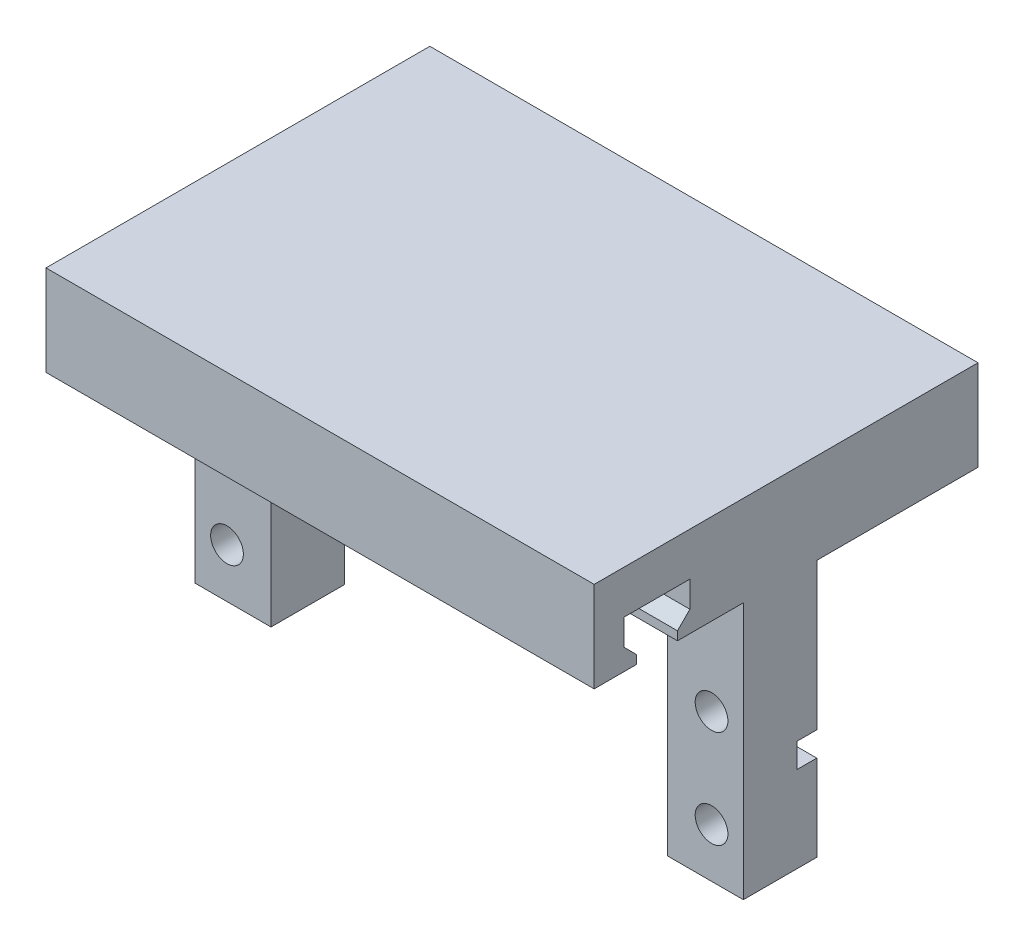
ISO-10303-21;
HEADER;
FILE_DESCRIPTION(('STEP AP214'),'2;1');
FILE_NAME('part.step','',(''),(''),'','','');
FILE_SCHEMA(('AUTOMOTIVE_DESIGN { 1 0 10303 214 1 1 1 1 }'));
ENDSEC;
DATA;
#1=APPLICATION_CONTEXT('core data for automotive mechanical design processes');
#2=APPLICATION_PROTOCOL_DEFINITION('international standard','automotive_design',2000,#1);
#3=PRODUCT_CONTEXT('',#1,'mechanical');
#4=PRODUCT('Part','Part','',(#3));
#5=PRODUCT_RELATED_PRODUCT_CATEGORY('part','',(#4));
#6=PRODUCT_DEFINITION_FORMATION('','',#4);
#7=PRODUCT_DEFINITION_CONTEXT('part definition',#1,'design');
#8=PRODUCT_DEFINITION('design','',#6,#7);
#9=PRODUCT_DEFINITION_SHAPE('','',#8);
#10=(LENGTH_UNIT() NAMED_UNIT(*) SI_UNIT(.MILLI.,.METRE.));
#11=(NAMED_UNIT(*) PLANE_ANGLE_UNIT() SI_UNIT($,.RADIAN.));
#12=(NAMED_UNIT(*) SI_UNIT($,.STERADIAN.) SOLID_ANGLE_UNIT());
#13=UNCERTAINTY_MEASURE_WITH_UNIT(LENGTH_MEASURE(1.E-05),#10,'distance_accuracy_value','');
#14=(GEOMETRIC_REPRESENTATION_CONTEXT(3) GLOBAL_UNCERTAINTY_ASSIGNED_CONTEXT((#13)) GLOBAL_UNIT_ASSIGNED_CONTEXT((#10,
#11,#12)) REPRESENTATION_CONTEXT('',''));
#15=CARTESIAN_POINT('',(0.,0.,0.));
#16=DIRECTION('',(0.,0.,1.));
#17=DIRECTION('',(1.,0.,0.));
#18=AXIS2_PLACEMENT_3D('',#15,#16,#17);
#19=CARTESIAN_POINT('',(-27.3203258381759,0.,24.0100013113022));
#20=DIRECTION('',(0.,0.,1.));
#21=DIRECTION('',(0.,-1.,0.));
#22=AXIS2_PLACEMENT_3D('',#19,#20,#21);
#23=PLANE('',#22);
#24=CARTESIAN_POINT('',(52.75,18.0000009930134,24.0100013113022));
#25=DIRECTION('',(0.,0.,1.));
#26=DIRECTION('',(1.,0.,0.));
#27=AXIS2_PLACEMENT_3D('',#24,#25,#26);
#28=CIRCLE('',#27,1.672);
#29=CARTESIAN_POINT('',(54.422,18.0000009930134,24.0100013113022));
#30=VERTEX_POINT('',#29);
#31=EDGE_CURVE('E501',#30,#30,#28,.F.);
#32=ORIENTED_EDGE('',*,*,#31,.T.);
#33=EDGE_LOOP('',(#32));
#34=FACE_BOUND('',#33,.T.);
#35=CARTESIAN_POINT('',(52.75,8.00000099301338,24.0100013113022));
#36=DIRECTION('',(0.,0.,1.));
#37=DIRECTION('',(1.,0.,0.));
#38=AXIS2_PLACEMENT_3D('',#35,#36,#37);
#39=CIRCLE('',#38,1.672);
#40=CARTESIAN_POINT('',(54.422,8.00000099301338,24.0100013113022));
#41=VERTEX_POINT('',#40);
#42=EDGE_CURVE('E502',#41,#41,#39,.F.);
#43=ORIENTED_EDGE('',*,*,#42,.T.);
#44=EDGE_LOOP('',(#43));
#45=FACE_BOUND('',#44,.T.);
#46=CARTESIAN_POINT('',(3.25,18.0000009930134,24.0100013113022));
#47=DIRECTION('',(0.,0.,1.));
#48=DIRECTION('',(1.,0.,0.));
#49=AXIS2_PLACEMENT_3D('',#46,#47,#48);
#50=CIRCLE('',#49,1.672);
#51=CARTESIAN_POINT('',(4.922,18.0000009930134,24.0100013113022));
#52=VERTEX_POINT('',#51);
#53=EDGE_CURVE('E494',#52,#52,#50,.T.);
#54=ORIENTED_EDGE('',*,*,#53,.F.);
#55=EDGE_LOOP('',(#54));
#56=FACE_BOUND('',#55,.T.);
#57=DIRECTION('',(1.,0.,0.));
#58=VECTOR('',#57,1.);
#59=CARTESIAN_POINT('',(-27.3203258381759,2.96929099301338,24.0100013113022));
#60=LINE('',#59,#58);
#61=CARTESIAN_POINT('',(0.,2.96929099301338,24.0100013113022));
#62=VERTEX_POINT('',#61);
#63=CARTESIAN_POINT('',(7.746,2.96929099301338,24.0100013113022));
#64=VERTEX_POINT('',#63);
#65=EDGE_CURVE('E238',#62,#64,#60,.T.);
#66=ORIENTED_EDGE('',*,*,#65,.T.);
#67=DIRECTION('',(0.,1.,0.));
#68=VECTOR('',#67,1.);
#69=CARTESIAN_POINT('',(7.746,0.,24.0100013113022));
#70=LINE('',#69,#68);
#71=CARTESIAN_POINT('',(7.746,23.6310009930134,24.0100013113022));
#72=VERTEX_POINT('',#71);
#73=EDGE_CURVE('E219',#64,#72,#70,.T.);
#74=ORIENTED_EDGE('',*,*,#73,.T.);
#75=DIRECTION('',(1.,0.,0.));
#76=VECTOR('',#75,1.);
#77=CARTESIAN_POINT('',(0.,23.6310009930134,24.0100013113022));
#78=LINE('',#77,#76);
#79=CARTESIAN_POINT('',(48.254,23.6310009930134,24.0100013113022));
#80=VERTEX_POINT('',#79);
#81=EDGE_CURVE('E243',#72,#80,#78,.T.);
#82=ORIENTED_EDGE('',*,*,#81,.T.);
#83=DIRECTION('',(0.,-1.,0.));
#84=VECTOR('',#83,1.);
#85=CARTESIAN_POINT('',(48.254,0.,24.0100013113022));
#86=LINE('',#85,#84);
#87=CARTESIAN_POINT('',(48.254,2.96929099301338,24.0100013113022));
#88=VERTEX_POINT('',#87);
#89=EDGE_CURVE('E230',#80,#88,#86,.T.);
#90=ORIENTED_EDGE('',*,*,#89,.T.);
#91=CARTESIAN_POINT('',(56.,2.96929099301338,24.0100013113022));
#92=VERTEX_POINT('',#91);
#93=EDGE_CURVE('E250',#88,#92,#60,.T.);
#94=ORIENTED_EDGE('',*,*,#93,.T.);
#95=DIRECTION('',(0.,-1.,0.));
#96=VECTOR('',#95,1.);
#97=CARTESIAN_POINT('',(56.,0.,24.0100013113022));
#98=LINE('',#97,#96);
#99=CARTESIAN_POINT('',(56.,29.2400009930134,24.0100013113022));
#100=VERTEX_POINT('',#99);
#101=EDGE_CURVE('E407',#100,#92,#98,.T.);
#102=ORIENTED_EDGE('',*,*,#101,.F.);
#103=DIRECTION('',(1.,0.,0.));
#104=VECTOR('',#103,1.);
#105=CARTESIAN_POINT('',(-27.3203258381759,29.2400009930134,24.0100013113022));
#106=LINE('',#105,#104);
#107=CARTESIAN_POINT('',(0.,29.2400009930134,24.0100013113022));
#108=VERTEX_POINT('',#107);
#109=EDGE_CURVE('E253',#108,#100,#106,.T.);
#110=ORIENTED_EDGE('',*,*,#109,.F.);
#111=DIRECTION('',(0.,1.,0.));
#112=VECTOR('',#111,1.);
#113=CARTESIAN_POINT('',(0.,0.,24.0100013113022));
#114=LINE('',#113,#112);
#115=EDGE_CURVE('E248',#62,#108,#114,.T.);
#116=ORIENTED_EDGE('',*,*,#115,.F.);
#117=EDGE_LOOP('',(#66,#74,#82,#90,#94,#102,#110,#116));
#118=FACE_BOUND('',#117,.T.);
#119=CARTESIAN_POINT('',(3.25,8.00000099301338,24.0100013113022));
#120=DIRECTION('',(0.,0.,1.));
#121=DIRECTION('',(1.,0.,0.));
#122=AXIS2_PLACEMENT_3D('',#119,#120,#121);
#123=CIRCLE('',#122,1.672);
#124=CARTESIAN_POINT('',(4.922,8.00000099301338,24.0100013113022));
#125=VERTEX_POINT('',#124);
#126=EDGE_CURVE('E508',#125,#125,#123,.T.);
#127=ORIENTED_EDGE('',*,*,#126,.F.);
#128=EDGE_LOOP('',(#127));
#129=FACE_BOUND('',#128,.T.);
#130=ADVANCED_FACE('F35',(#34,#45,#56,#118,#129),#23,.T.);
#131=CARTESIAN_POINT('',(-27.3203258381759,2.96929099301338,0.));
#132=DIRECTION('',(0.,-1.,0.));
#133=DIRECTION('',(0.,0.,-1.));
#134=AXIS2_PLACEMENT_3D('',#131,#132,#133);
#135=PLANE('',#134);
#136=DIRECTION('',(1.,0.,0.));
#137=VECTOR('',#136,1.);
#138=CARTESIAN_POINT('',(-27.3203258381759,2.96929099301338,16.5100013113022));
#139=LINE('',#138,#137);
#140=CARTESIAN_POINT('',(0.,2.96929099301338,16.5100013113022));
#141=VERTEX_POINT('',#140);
#142=CARTESIAN_POINT('',(7.746,2.96929099301338,16.5100013113022));
#143=VERTEX_POINT('',#142);
#144=EDGE_CURVE('E241',#141,#143,#139,.T.);
#145=ORIENTED_EDGE('',*,*,#144,.T.);
#146=DIRECTION('',(0.,0.,1.));
#147=VECTOR('',#146,1.);
#148=CARTESIAN_POINT('',(7.746,2.96929099301338,-28.9631151876151));
#149=LINE('',#148,#147);
#150=EDGE_CURVE('E222',#143,#64,#149,.T.);
#151=ORIENTED_EDGE('',*,*,#150,.T.);
#152=ORIENTED_EDGE('',*,*,#65,.F.);
#153=DIRECTION('',(0.,0.,1.));
#154=VECTOR('',#153,1.);
#155=CARTESIAN_POINT('',(0.,2.96929099301338,0.));
#156=LINE('',#155,#154);
#157=EDGE_CURVE('E473',#141,#62,#156,.T.);
#158=ORIENTED_EDGE('',*,*,#157,.F.);
#159=EDGE_LOOP('',(#145,#151,#152,#158));
#160=FACE_BOUND('',#159,.T.);
#161=ADVANCED_FACE('F236',(#160),#135,.T.);
#162=ORIENTED_EDGE('',*,*,#93,.F.);
#163=DIRECTION('',(0.,0.,1.));
#164=VECTOR('',#163,1.);
#165=CARTESIAN_POINT('',(48.254,2.96929099301338,-28.9631151876151));
#166=LINE('',#165,#164);
#167=CARTESIAN_POINT('',(48.254,2.96929099301338,16.5100013113022));
#168=VERTEX_POINT('',#167);
#169=EDGE_CURVE('E242',#168,#88,#166,.T.);
#170=ORIENTED_EDGE('',*,*,#169,.F.);
#171=CARTESIAN_POINT('',(56.,2.96929099301338,16.5100013113022));
#172=VERTEX_POINT('',#171);
#173=EDGE_CURVE('E249',#168,#172,#139,.T.);
#174=ORIENTED_EDGE('',*,*,#173,.T.);
#175=DIRECTION('',(0.,0.,-1.));
#176=VECTOR('',#175,1.);
#177=CARTESIAN_POINT('',(56.,2.96929099301338,0.));
#178=LINE('',#177,#176);
#179=EDGE_CURVE('E411',#92,#172,#178,.T.);
#180=ORIENTED_EDGE('',*,*,#179,.F.);
#181=EDGE_LOOP('',(#162,#170,#174,#180));
#182=FACE_BOUND('',#181,.T.);
#183=ADVANCED_FACE('F453',(#182),#135,.T.);
#184=CARTESIAN_POINT('',(-27.3203258381759,0.,16.5100013113022));
#185=DIRECTION('',(0.,0.,1.));
#186=DIRECTION('',(1.,0.,0.));
#187=AXIS2_PLACEMENT_3D('',#184,#185,#186);
#188=PLANE('',#187);
#189=CARTESIAN_POINT('',(3.25,8.00000099301338,16.5100013113022));
#190=DIRECTION('',(0.,0.,1.));
#191=DIRECTION('',(1.,0.,0.));
#192=AXIS2_PLACEMENT_3D('',#189,#190,#191);
#193=CIRCLE('',#192,1.672);
#194=CARTESIAN_POINT('',(4.922,8.00000099301338,16.5100013113022));
#195=VERTEX_POINT('',#194);
#196=EDGE_CURVE('E497',#195,#195,#193,.F.);
#197=ORIENTED_EDGE('',*,*,#196,.F.);
#198=EDGE_LOOP('',(#197));
#199=FACE_BOUND('',#198,.T.);
#200=DIRECTION('',(0.,-1.,0.));
#201=VECTOR('',#200,1.);
#202=CARTESIAN_POINT('',(7.746,0.,16.5100013113022));
#203=LINE('',#202,#201);
#204=CARTESIAN_POINT('',(7.746,11.7500009930134,16.5100013113022));
#205=VERTEX_POINT('',#204);
#206=EDGE_CURVE('E484',#205,#143,#203,.T.);
#207=ORIENTED_EDGE('',*,*,#206,.T.);
#208=ORIENTED_EDGE('',*,*,#144,.F.);
#209=DIRECTION('',(0.,1.,0.));
#210=VECTOR('',#209,1.);
#211=CARTESIAN_POINT('',(0.,0.,16.5100013113022));
#212=LINE('',#211,#210);
#213=CARTESIAN_POINT('',(0.,11.7500009930134,16.5100013113022));
#214=VERTEX_POINT('',#213);
#215=EDGE_CURVE('E475',#141,#214,#212,.T.);
#216=ORIENTED_EDGE('',*,*,#215,.T.);
#217=DIRECTION('',(1.,0.,0.));
#218=VECTOR('',#217,1.);
#219=CARTESIAN_POINT('',(-27.3203258381759,11.7500009930134,16.5100013113022));
#220=LINE('',#219,#218);
#221=EDGE_CURVE('E430',#214,#205,#220,.T.);
#222=ORIENTED_EDGE('',*,*,#221,.T.);
#223=EDGE_LOOP('',(#207,#208,#216,#222));
#224=FACE_BOUND('',#223,.T.);
#225=ADVANCED_FACE('F628',(#199,#224),#188,.F.);
#226=CARTESIAN_POINT('',(52.75,8.00000099301338,16.5100013113022));
#227=DIRECTION('',(0.,0.,1.));
#228=DIRECTION('',(1.,0.,0.));
#229=AXIS2_PLACEMENT_3D('',#226,#227,#228);
#230=CIRCLE('',#229,1.672);
#231=CARTESIAN_POINT('',(54.422,8.00000099301338,16.5100013113022));
#232=VERTEX_POINT('',#231);
#233=EDGE_CURVE('E498',#232,#232,#230,.T.);
#234=ORIENTED_EDGE('',*,*,#233,.T.);
#235=EDGE_LOOP('',(#234));
#236=FACE_BOUND('',#235,.T.);
#237=DIRECTION('',(0.,1.,0.));
#238=VECTOR('',#237,1.);
#239=CARTESIAN_POINT('',(48.254,0.,16.5100013113022));
#240=LINE('',#239,#238);
#241=CARTESIAN_POINT('',(48.254,11.7500009930134,16.5100013113022));
#242=VERTEX_POINT('',#241);
#243=EDGE_CURVE('E442',#168,#242,#240,.T.);
#244=ORIENTED_EDGE('',*,*,#243,.T.);
#245=CARTESIAN_POINT('',(56.,11.7500009930134,16.5100013113022));
#246=VERTEX_POINT('',#245);
#247=EDGE_CURVE('E432',#242,#246,#220,.T.);
#248=ORIENTED_EDGE('',*,*,#247,.T.);
#249=DIRECTION('',(0.,-1.,0.));
#250=VECTOR('',#249,1.);
#251=CARTESIAN_POINT('',(56.,0.,16.5100013113022));
#252=LINE('',#251,#250);
#253=EDGE_CURVE('E414',#246,#172,#252,.T.);
#254=ORIENTED_EDGE('',*,*,#253,.T.);
#255=ORIENTED_EDGE('',*,*,#173,.F.);
#256=EDGE_LOOP('',(#244,#248,#254,#255));
#257=FACE_BOUND('',#256,.T.);
#258=ADVANCED_FACE('F439',(#236,#257),#188,.F.);
#259=CARTESIAN_POINT('',(-27.3203258381759,11.7500009930134,0.));
#260=DIRECTION('',(0.,-1.,0.));
#261=DIRECTION('',(0.,0.,-1.));
#262=AXIS2_PLACEMENT_3D('',#259,#260,#261);
#263=PLANE('',#262);
#264=DIRECTION('',(0.,0.,1.));
#265=VECTOR('',#264,1.);
#266=CARTESIAN_POINT('',(7.746,11.7500009930134,0.));
#267=LINE('',#266,#265);
#268=CARTESIAN_POINT('',(7.746,11.7500009930134,18.5100013113022));
#269=VERTEX_POINT('',#268);
#270=EDGE_CURVE('E408',#205,#269,#267,.T.);
#271=ORIENTED_EDGE('',*,*,#270,.F.);
#272=ORIENTED_EDGE('',*,*,#221,.F.);
#273=DIRECTION('',(0.,0.,1.));
#274=VECTOR('',#273,1.);
#275=CARTESIAN_POINT('',(0.,11.7500009930134,0.));
#276=LINE('',#275,#274);
#277=CARTESIAN_POINT('',(0.,11.7500009930134,18.5100013113022));
#278=VERTEX_POINT('',#277);
#279=EDGE_CURVE('E400',#214,#278,#276,.T.);
#280=ORIENTED_EDGE('',*,*,#279,.T.);
#281=DIRECTION('',(1.,0.,0.));
#282=VECTOR('',#281,1.);
#283=CARTESIAN_POINT('',(-27.3203258381759,11.7500009930134,18.5100013113022));
#284=LINE('',#283,#282);
#285=EDGE_CURVE('E427',#278,#269,#284,.T.);
#286=ORIENTED_EDGE('',*,*,#285,.T.);
#287=EDGE_LOOP('',(#271,#272,#280,#286));
#288=FACE_BOUND('',#287,.T.);
#289=ADVANCED_FACE('F479',(#288),#263,.F.);
#290=DIRECTION('',(0.,0.,-1.));
#291=VECTOR('',#290,1.);
#292=CARTESIAN_POINT('',(48.254,11.7500009930134,0.));
#293=LINE('',#292,#291);
#294=CARTESIAN_POINT('',(48.254,11.7500009930134,18.5100013113022));
#295=VERTEX_POINT('',#294);
#296=EDGE_CURVE('E465',#295,#242,#293,.T.);
#297=ORIENTED_EDGE('',*,*,#296,.F.);
#298=CARTESIAN_POINT('',(56.,11.7500009930134,18.5100013113022));
#299=VERTEX_POINT('',#298);
#300=EDGE_CURVE('E429',#295,#299,#284,.T.);
#301=ORIENTED_EDGE('',*,*,#300,.T.);
#302=DIRECTION('',(0.,0.,-1.));
#303=VECTOR('',#302,1.);
#304=CARTESIAN_POINT('',(56.,11.7500009930134,0.));
#305=LINE('',#304,#303);
#306=EDGE_CURVE('E417',#299,#246,#305,.T.);
#307=ORIENTED_EDGE('',*,*,#306,.T.);
#308=ORIENTED_EDGE('',*,*,#247,.F.);
#309=EDGE_LOOP('',(#297,#301,#307,#308));
#310=FACE_BOUND('',#309,.T.);
#311=ADVANCED_FACE('F446',(#310),#263,.F.);
#312=CARTESIAN_POINT('',(-27.3203258381759,0.,18.5100013113022));
#313=DIRECTION('',(0.,0.,1.));
#314=DIRECTION('',(0.,-1.,0.));
#315=AXIS2_PLACEMENT_3D('',#312,#313,#314);
#316=PLANE('',#315);
#317=DIRECTION('',(0.,1.,0.));
#318=VECTOR('',#317,1.);
#319=CARTESIAN_POINT('',(7.746,0.,18.5100013113022));
#320=LINE('',#319,#318);
#321=CARTESIAN_POINT('',(7.746,14.2500009930134,18.5100013113022));
#322=VERTEX_POINT('',#321);
#323=EDGE_CURVE('E469',#269,#322,#320,.T.);
#324=ORIENTED_EDGE('',*,*,#323,.F.);
#325=ORIENTED_EDGE('',*,*,#285,.F.);
#326=DIRECTION('',(0.,1.,0.));
#327=VECTOR('',#326,1.);
#328=CARTESIAN_POINT('',(0.,0.,18.5100013113022));
#329=LINE('',#328,#327);
#330=CARTESIAN_POINT('',(0.,14.2500009930134,18.5100013113022));
#331=VERTEX_POINT('',#330);
#332=EDGE_CURVE('E398',#278,#331,#329,.T.);
#333=ORIENTED_EDGE('',*,*,#332,.T.);
#334=DIRECTION('',(1.,0.,0.));
#335=VECTOR('',#334,1.);
#336=CARTESIAN_POINT('',(-27.3203258381759,14.2500009930134,18.5100013113022));
#337=LINE('',#336,#335);
#338=EDGE_CURVE('E396',#331,#322,#337,.T.);
#339=ORIENTED_EDGE('',*,*,#338,.T.);
#340=EDGE_LOOP('',(#324,#325,#333,#339));
#341=FACE_BOUND('',#340,.T.);
#342=ADVANCED_FACE('F483',(#341),#316,.F.);
#343=DIRECTION('',(0.,-1.,0.));
#344=VECTOR('',#343,1.);
#345=CARTESIAN_POINT('',(48.254,0.,18.5100013113022));
#346=LINE('',#345,#344);
#347=CARTESIAN_POINT('',(48.254,14.2500009930134,18.5100013113022));
#348=VERTEX_POINT('',#347);
#349=EDGE_CURVE('E463',#348,#295,#346,.T.);
#350=ORIENTED_EDGE('',*,*,#349,.F.);
#351=CARTESIAN_POINT('',(56.,14.2500009930134,18.5100013113022));
#352=VERTEX_POINT('',#351);
#353=EDGE_CURVE('E426',#348,#352,#337,.T.);
#354=ORIENTED_EDGE('',*,*,#353,.T.);
#355=DIRECTION('',(0.,-1.,0.));
#356=VECTOR('',#355,1.);
#357=CARTESIAN_POINT('',(56.,0.,18.5100013113022));
#358=LINE('',#357,#356);
#359=EDGE_CURVE('E420',#352,#299,#358,.T.);
#360=ORIENTED_EDGE('',*,*,#359,.T.);
#361=ORIENTED_EDGE('',*,*,#300,.F.);
#362=EDGE_LOOP('',(#350,#354,#360,#361));
#363=FACE_BOUND('',#362,.T.);
#364=ADVANCED_FACE('F599',(#363),#316,.F.);
#365=CARTESIAN_POINT('',(-27.3203258381759,14.2500009930134,0.));
#366=DIRECTION('',(0.,-1.,0.));
#367=DIRECTION('',(0.,0.,-1.));
#368=AXIS2_PLACEMENT_3D('',#365,#366,#367);
#369=PLANE('',#368);
#370=DIRECTION('',(1.,0.,0.));
#371=VECTOR('',#370,1.);
#372=CARTESIAN_POINT('',(-27.3203258381759,14.2500009930134,16.5100013113022));
#373=LINE('',#372,#371);
#374=CARTESIAN_POINT('',(0.,14.2500009930134,16.5100013113022));
#375=VERTEX_POINT('',#374);
#376=CARTESIAN_POINT('',(7.746,14.2500009930134,16.5100013113022));
#377=VERTEX_POINT('',#376);
#378=EDGE_CURVE('E386',#375,#377,#373,.T.);
#379=ORIENTED_EDGE('',*,*,#378,.T.);
#380=DIRECTION('',(0.,0.,1.));
#381=VECTOR('',#380,1.);
#382=CARTESIAN_POINT('',(7.746,14.2500009930134,0.));
#383=LINE('',#382,#381);
#384=EDGE_CURVE('E467',#377,#322,#383,.T.);
#385=ORIENTED_EDGE('',*,*,#384,.T.);
#386=ORIENTED_EDGE('',*,*,#338,.F.);
#387=DIRECTION('',(0.,0.,1.));
#388=VECTOR('',#387,1.);
#389=CARTESIAN_POINT('',(0.,14.2500009930134,0.));
#390=LINE('',#389,#388);
#391=EDGE_CURVE('E380',#375,#331,#390,.T.);
#392=ORIENTED_EDGE('',*,*,#391,.F.);
#393=EDGE_LOOP('',(#379,#385,#386,#392));
#394=FACE_BOUND('',#393,.T.);
#395=ADVANCED_FACE('F394',(#394),#369,.T.);
#396=ORIENTED_EDGE('',*,*,#353,.F.);
#397=DIRECTION('',(0.,0.,-1.));
#398=VECTOR('',#397,1.);
#399=CARTESIAN_POINT('',(48.254,14.2500009930134,0.));
#400=LINE('',#399,#398);
#401=CARTESIAN_POINT('',(48.254,14.2500009930134,16.5100013113022));
#402=VERTEX_POINT('',#401);
#403=EDGE_CURVE('E460',#348,#402,#400,.T.);
#404=ORIENTED_EDGE('',*,*,#403,.T.);
#405=CARTESIAN_POINT('',(56.,14.2500009930134,16.5100013113022));
#406=VERTEX_POINT('',#405);
#407=EDGE_CURVE('E392',#402,#406,#373,.T.);
#408=ORIENTED_EDGE('',*,*,#407,.T.);
#409=DIRECTION('',(0.,0.,-1.));
#410=VECTOR('',#409,1.);
#411=CARTESIAN_POINT('',(56.,14.2500009930134,0.));
#412=LINE('',#411,#410);
#413=EDGE_CURVE('E259',#352,#406,#412,.T.);
#414=ORIENTED_EDGE('',*,*,#413,.F.);
#415=EDGE_LOOP('',(#396,#404,#408,#414));
#416=FACE_BOUND('',#415,.T.);
#417=ADVANCED_FACE('F529',(#416),#369,.T.);
#418=CARTESIAN_POINT('',(-27.3203258381759,0.,16.5100013113022));
#419=DIRECTION('',(0.,0.,1.));
#420=DIRECTION('',(1.,0.,0.));
#421=AXIS2_PLACEMENT_3D('',#418,#419,#420);
#422=PLANE('',#421);
#423=CARTESIAN_POINT('',(52.75,18.0000009930134,16.5100013113022));
#424=DIRECTION('',(0.,0.,1.));
#425=DIRECTION('',(1.,0.,0.));
#426=AXIS2_PLACEMENT_3D('',#423,#424,#425);
#427=CIRCLE('',#426,1.672);
#428=CARTESIAN_POINT('',(54.422,18.0000009930134,16.5100013113022));
#429=VERTEX_POINT('',#428);
#430=EDGE_CURVE('E505',#429,#429,#427,.T.);
#431=ORIENTED_EDGE('',*,*,#430,.T.);
#432=EDGE_LOOP('',(#431));
#433=FACE_BOUND('',#432,.T.);
#434=CARTESIAN_POINT('',(3.25,18.0000009930134,16.5100013113022));
#435=DIRECTION('',(0.,0.,1.));
#436=DIRECTION('',(1.,0.,0.));
#437=AXIS2_PLACEMENT_3D('',#434,#435,#436);
#438=CIRCLE('',#437,1.672);
#439=CARTESIAN_POINT('',(4.922,18.0000009930134,16.5100013113022));
#440=VERTEX_POINT('',#439);
#441=EDGE_CURVE('E231',#440,#440,#438,.F.);
#442=ORIENTED_EDGE('',*,*,#441,.F.);
#443=EDGE_LOOP('',(#442));
#444=FACE_BOUND('',#443,.T.);
#445=CARTESIAN_POINT('',(7.746,23.6310009930134,16.5100013113022));
#446=VERTEX_POINT('',#445);
#447=EDGE_CURVE('E389',#446,#377,#203,.T.);
#448=ORIENTED_EDGE('',*,*,#447,.T.);
#449=ORIENTED_EDGE('',*,*,#378,.F.);
#450=DIRECTION('',(0.,1.,0.));
#451=VECTOR('',#450,1.);
#452=CARTESIAN_POINT('',(0.,0.,16.5100013113022));
#453=LINE('',#452,#451);
#454=CARTESIAN_POINT('',(0.,29.2400009930134,16.5100013113022));
#455=VERTEX_POINT('',#454);
#456=EDGE_CURVE('E292',#375,#455,#453,.T.);
#457=ORIENTED_EDGE('',*,*,#456,.T.);
#458=DIRECTION('',(1.,0.,0.));
#459=VECTOR('',#458,1.);
#460=CARTESIAN_POINT('',(-27.3203258381759,29.2400009930134,16.5100013113022));
#461=LINE('',#460,#459);
#462=CARTESIAN_POINT('',(56.,29.2400009930134,16.5100013113022));
#463=VERTEX_POINT('',#462);
#464=EDGE_CURVE('E257',#455,#463,#461,.T.);
#465=ORIENTED_EDGE('',*,*,#464,.T.);
#466=DIRECTION('',(0.,-1.,0.));
#467=VECTOR('',#466,1.);
#468=CARTESIAN_POINT('',(56.,0.,16.5100013113022));
#469=LINE('',#468,#467);
#470=EDGE_CURVE('E404',#463,#406,#469,.T.);
#471=ORIENTED_EDGE('',*,*,#470,.T.);
#472=ORIENTED_EDGE('',*,*,#407,.F.);
#473=DIRECTION('',(0.,-1.,0.));
#474=VECTOR('',#473,1.);
#475=CARTESIAN_POINT('',(48.254,0.,16.5100013113022));
#476=LINE('',#475,#474);
#477=CARTESIAN_POINT('',(48.254,23.6310009930134,16.5100013113022));
#478=VERTEX_POINT('',#477);
#479=EDGE_CURVE('E11',#478,#402,#476,.T.);
#480=ORIENTED_EDGE('',*,*,#479,.F.);
#481=DIRECTION('',(-1.,0.,0.));
#482=VECTOR('',#481,1.);
#483=CARTESIAN_POINT('',(0.,23.6310009930134,16.5100013113022));
#484=LINE('',#483,#482);
#485=EDGE_CURVE('E485',#478,#446,#484,.T.);
#486=ORIENTED_EDGE('',*,*,#485,.T.);
#487=EDGE_LOOP('',(#448,#449,#457,#465,#471,#472,#480,#486));
#488=FACE_BOUND('',#487,.T.);
#489=ADVANCED_FACE('F387',(#433,#444,#488),#422,.F.);
#490=CARTESIAN_POINT('',(56.,29.2400009930134,30.73950111866));
#491=DIRECTION('',(0.,1.,0.));
#492=DIRECTION('',(0.,0.,1.));
#493=AXIS2_PLACEMENT_3D('',#490,#491,#492);
#494=PLANE('',#493);
#495=ORIENTED_EDGE('',*,*,#464,.F.);
#496=DIRECTION('',(0.,0.,-1.));
#497=VECTOR('',#496,1.);
#498=CARTESIAN_POINT('',(0.,29.2400009930134,30.73950111866));
#499=LINE('',#498,#497);
#500=CARTESIAN_POINT('',(0.,29.2400009930134,0.0385884195566177));
#501=VERTEX_POINT('',#500);
#502=EDGE_CURVE('E310',#455,#501,#499,.T.);
#503=ORIENTED_EDGE('',*,*,#502,.T.);
#504=DIRECTION('',(-1.,0.,0.));
#505=VECTOR('',#504,1.);
#506=CARTESIAN_POINT('',(56.,29.2400009930134,0.0385884195566177));
#507=LINE('',#506,#505);
#508=CARTESIAN_POINT('',(56.,29.2400009930134,0.0385884195566177));
#509=VERTEX_POINT('',#508);
#510=EDGE_CURVE('E316',#509,#501,#507,.T.);
#511=ORIENTED_EDGE('',*,*,#510,.F.);
#512=DIRECTION('',(0.,0.,-1.));
#513=VECTOR('',#512,1.);
#514=CARTESIAN_POINT('',(56.,29.2400009930134,30.73950111866));
#515=LINE('',#514,#513);
#516=EDGE_CURVE('E57',#463,#509,#515,.T.);
#517=ORIENTED_EDGE('',*,*,#516,.F.);
#518=EDGE_LOOP('',(#495,#503,#511,#517));
#519=FACE_BOUND('',#518,.T.);
#520=ADVANCED_FACE('F376',(#519),#494,.F.);
#521=CARTESIAN_POINT('',(56.,38.4900011122227,0.0385884195566177));
#522=DIRECTION('',(0.,-1.,0.));
#523=DIRECTION('',(0.,0.,-1.));
#524=AXIS2_PLACEMENT_3D('',#521,#522,#523);
#525=PLANE('',#524);
#526=DIRECTION('',(0.,0.,1.));
#527=VECTOR('',#526,1.);
#528=CARTESIAN_POINT('',(0.,38.4900011122227,0.0385884195566177));
#529=LINE('',#528,#527);
#530=CARTESIAN_POINT('',(0.,38.4900011122227,0.0385884195566177));
#531=VERTEX_POINT('',#530);
#532=CARTESIAN_POINT('',(0.,38.4900011122227,39.2500013113022));
#533=VERTEX_POINT('',#532);
#534=EDGE_CURVE('E288',#531,#533,#529,.T.);
#535=ORIENTED_EDGE('',*,*,#534,.T.);
#536=DIRECTION('',(-1.,0.,0.));
#537=VECTOR('',#536,1.);
#538=CARTESIAN_POINT('',(56.,38.4900011122227,39.2500013113022));
#539=LINE('',#538,#537);
#540=CARTESIAN_POINT('',(56.,38.4900011122227,39.2500013113022));
#541=VERTEX_POINT('',#540);
#542=EDGE_CURVE('E43',#541,#533,#539,.T.);
#543=ORIENTED_EDGE('',*,*,#542,.F.);
#544=DIRECTION('',(0.,0.,1.));
#545=VECTOR('',#544,1.);
#546=CARTESIAN_POINT('',(56.,38.4900011122227,0.0385884195566177));
#547=LINE('',#546,#545);
#548=CARTESIAN_POINT('',(56.,38.4900011122227,0.0385884195566177));
#549=VERTEX_POINT('',#548);
#550=EDGE_CURVE('E260',#549,#541,#547,.T.);
#551=ORIENTED_EDGE('',*,*,#550,.F.);
#552=DIRECTION('',(-1.,0.,0.));
#553=VECTOR('',#552,1.);
#554=CARTESIAN_POINT('',(56.,38.4900011122227,0.0385884195566177));
#555=LINE('',#554,#553);
#556=EDGE_CURVE('E287',#549,#531,#555,.T.);
#557=ORIENTED_EDGE('',*,*,#556,.T.);
#558=EDGE_LOOP('',(#535,#543,#551,#557));
#559=FACE_BOUND('',#558,.T.);
#560=ADVANCED_FACE('F37',(#559),#525,.F.);
#561=CARTESIAN_POINT('',(56.,38.4900011122227,39.2500013113022));
#562=DIRECTION('',(0.,0.,-1.));
#563=DIRECTION('',(-1.,0.,0.));
#564=AXIS2_PLACEMENT_3D('',#561,#562,#563);
#565=PLANE('',#564);
#566=DIRECTION('',(0.,-1.,0.));
#567=VECTOR('',#566,1.);
#568=CARTESIAN_POINT('',(0.,38.4900011122227,39.2500013113022));
#569=LINE('',#568,#567);
#570=CARTESIAN_POINT('',(0.,29.2400009930134,39.2500013113022));
#571=VERTEX_POINT('',#570);
#572=EDGE_CURVE('E291',#533,#571,#569,.T.);
#573=ORIENTED_EDGE('',*,*,#572,.T.);
#574=DIRECTION('',(-1.,0.,0.));
#575=VECTOR('',#574,1.);
#576=CARTESIAN_POINT('',(56.,29.2400009930134,39.2500013113022));
#577=LINE('',#576,#575);
#578=CARTESIAN_POINT('',(56.,29.2400009930134,39.2500013113022));
#579=VERTEX_POINT('',#578);
#580=EDGE_CURVE('E343',#579,#571,#577,.T.);
#581=ORIENTED_EDGE('',*,*,#580,.F.);
#582=DIRECTION('',(0.,-1.,0.));
#583=VECTOR('',#582,1.);
#584=CARTESIAN_POINT('',(56.,38.4900011122227,39.2500013113022));
#585=LINE('',#584,#583);
#586=EDGE_CURVE('E263',#541,#579,#585,.T.);
#587=ORIENTED_EDGE('',*,*,#586,.F.);
#588=ORIENTED_EDGE('',*,*,#542,.T.);
#589=EDGE_LOOP('',(#573,#581,#587,#588));
#590=FACE_BOUND('',#589,.T.);
#591=ADVANCED_FACE('F348',(#590),#565,.F.);
#592=CARTESIAN_POINT('',(56.,29.2400009930134,34.9305011332035));
#593=DIRECTION('',(0.,1.,0.));
#594=DIRECTION('',(0.,0.,1.));
#595=AXIS2_PLACEMENT_3D('',#592,#593,#594);
#596=PLANE('',#595);
#597=DIRECTION('',(0.,0.,-1.));
#598=VECTOR('',#597,1.);
#599=CARTESIAN_POINT('',(0.,29.2400009930134,34.9305011332035));
#600=LINE('',#599,#598);
#601=CARTESIAN_POINT('',(0.,29.2400009930134,34.9305011332035));
#602=VERTEX_POINT('',#601);
#603=EDGE_CURVE('E294',#571,#602,#600,.T.);
#604=ORIENTED_EDGE('',*,*,#603,.T.);
#605=DIRECTION('',(-1.,0.,0.));
#606=VECTOR('',#605,1.);
#607=CARTESIAN_POINT('',(56.,29.2400009930134,34.9305011332035));
#608=LINE('',#607,#606);
#609=CARTESIAN_POINT('',(56.,29.2400009930134,34.9305011332035));
#610=VERTEX_POINT('',#609);
#611=EDGE_CURVE('E340',#610,#602,#608,.T.);
#612=ORIENTED_EDGE('',*,*,#611,.F.);
#613=DIRECTION('',(0.,0.,-1.));
#614=VECTOR('',#613,1.);
#615=CARTESIAN_POINT('',(56.,29.2400009930134,34.9305011332035));
#616=LINE('',#615,#614);
#617=EDGE_CURVE('E266',#579,#610,#616,.T.);
#618=ORIENTED_EDGE('',*,*,#617,.F.);
#619=ORIENTED_EDGE('',*,*,#580,.T.);
#620=EDGE_LOOP('',(#604,#612,#618,#619));
#621=FACE_BOUND('',#620,.T.);
#622=ADVANCED_FACE('F362',(#621),#596,.F.);
#623=CARTESIAN_POINT('',(56.,29.2400009930134,34.9305011332035));
#624=DIRECTION('',(0.,0.,1.));
#625=DIRECTION('',(1.,0.,0.));
#626=AXIS2_PLACEMENT_3D('',#623,#624,#625);
#627=PLANE('',#626);
#628=DIRECTION('',(0.,1.,0.));
#629=VECTOR('',#628,1.);
#630=CARTESIAN_POINT('',(0.,29.2400009930134,34.9305011332035));
#631=LINE('',#630,#629);
#632=CARTESIAN_POINT('',(0.,30.129000544548,34.9305011332035));
#633=VERTEX_POINT('',#632);
#634=EDGE_CURVE('E296',#602,#633,#631,.T.);
#635=ORIENTED_EDGE('',*,*,#634,.T.);
#636=DIRECTION('',(-1.,0.,0.));
#637=VECTOR('',#636,1.);
#638=CARTESIAN_POINT('',(56.,30.129000544548,34.9305011332035));
#639=LINE('',#638,#637);
#640=CARTESIAN_POINT('',(56.,30.129000544548,34.9305011332035));
#641=VERTEX_POINT('',#640);
#642=EDGE_CURVE('E337',#641,#633,#639,.T.);
#643=ORIENTED_EDGE('',*,*,#642,.F.);
#644=DIRECTION('',(0.,1.,0.));
#645=VECTOR('',#644,1.);
#646=CARTESIAN_POINT('',(56.,29.2400009930134,34.9305011332035));
#647=LINE('',#646,#645);
#648=EDGE_CURVE('E268',#610,#641,#647,.T.);
#649=ORIENTED_EDGE('',*,*,#648,.F.);
#650=ORIENTED_EDGE('',*,*,#611,.T.);
#651=EDGE_LOOP('',(#635,#643,#649,#650));
#652=FACE_BOUND('',#651,.T.);
#653=ADVANCED_FACE('F366',(#652),#627,.F.);
#654=CARTESIAN_POINT('',(56.,30.129000544548,34.9305011332035));
#655=DIRECTION('',(0.,-0.707106781186548,0.707106781186548));
#656=DIRECTION('',(0.,-0.707106781186548,-0.707106781186548));
#657=AXIS2_PLACEMENT_3D('',#654,#655,#656);
#658=PLANE('',#657);
#659=DIRECTION('',(0.,0.707106781186547,0.707106781186547));
#660=VECTOR('',#659,1.);
#661=CARTESIAN_POINT('',(0.,30.129000544548,34.9305011332035));
#662=LINE('',#661,#660);
#663=CARTESIAN_POINT('',(0.,31.3990004360676,36.2005010247231));
#664=VERTEX_POINT('',#663);
#665=EDGE_CURVE('E298',#633,#664,#662,.T.);
#666=ORIENTED_EDGE('',*,*,#665,.T.);
#667=DIRECTION('',(-1.,0.,0.));
#668=VECTOR('',#667,1.);
#669=CARTESIAN_POINT('',(56.,31.3990004360676,36.2005010247231));
#670=LINE('',#669,#668);
#671=CARTESIAN_POINT('',(56.,31.3990004360676,36.2005010247231));
#672=VERTEX_POINT('',#671);
#673=EDGE_CURVE('E334',#672,#664,#670,.T.);
#674=ORIENTED_EDGE('',*,*,#673,.F.);
#675=DIRECTION('',(0.,0.707106781186547,0.707106781186547));
#676=VECTOR('',#675,1.);
#677=CARTESIAN_POINT('',(56.,30.129000544548,34.9305011332035));
#678=LINE('',#677,#676);
#679=EDGE_CURVE('E270',#641,#672,#678,.T.);
#680=ORIENTED_EDGE('',*,*,#679,.F.);
#681=ORIENTED_EDGE('',*,*,#642,.T.);
#682=EDGE_LOOP('',(#666,#674,#680,#681));
#683=FACE_BOUND('',#682,.T.);
#684=ADVANCED_FACE('F560',(#683),#658,.F.);
#685=CARTESIAN_POINT('',(56.,31.3990004360676,36.2005010247231));
#686=DIRECTION('',(0.,0.,1.));
#687=DIRECTION('',(1.,0.,0.));
#688=AXIS2_PLACEMENT_3D('',#685,#686,#687);
#689=PLANE('',#688);
#690=DIRECTION('',(0.,1.,0.));
#691=VECTOR('',#690,1.);
#692=CARTESIAN_POINT('',(0.,31.3990004360676,36.2005010247231));
#693=LINE('',#692,#691);
#694=CARTESIAN_POINT('',(0.,34.0659990906715,36.2005010247231));
#695=VERTEX_POINT('',#694);
#696=EDGE_CURVE('E300',#664,#695,#693,.T.);
#697=ORIENTED_EDGE('',*,*,#696,.T.);
#698=DIRECTION('',(-1.,0.,0.));
#699=VECTOR('',#698,1.);
#700=CARTESIAN_POINT('',(56.,34.0659990906715,36.2005010247231));
#701=LINE('',#700,#699);
#702=CARTESIAN_POINT('',(56.,34.0659990906715,36.2005010247231));
#703=VERTEX_POINT('',#702);
#704=EDGE_CURVE('E331',#703,#695,#701,.T.);
#705=ORIENTED_EDGE('',*,*,#704,.F.);
#706=DIRECTION('',(0.,1.,0.));
#707=VECTOR('',#706,1.);
#708=CARTESIAN_POINT('',(56.,31.3990004360676,36.2005010247231));
#709=LINE('',#708,#707);
#710=EDGE_CURVE('E272',#672,#703,#709,.T.);
#711=ORIENTED_EDGE('',*,*,#710,.F.);
#712=ORIENTED_EDGE('',*,*,#673,.T.);
#713=EDGE_LOOP('',(#697,#705,#711,#712));
#714=FACE_BOUND('',#713,.T.);
#715=ADVANCED_FACE('F556',(#714),#689,.F.);
#716=CARTESIAN_POINT('',(56.,34.0659990906715,36.2005010247231));
#717=DIRECTION('',(0.,1.,0.));
#718=DIRECTION('',(0.,0.,1.));
#719=AXIS2_PLACEMENT_3D('',#716,#717,#718);
#720=PLANE('',#719);
#721=DIRECTION('',(0.,0.,-1.));
#722=VECTOR('',#721,1.);
#723=CARTESIAN_POINT('',(0.,34.0659990906715,36.2005010247231));
#724=LINE('',#723,#722);
#725=CARTESIAN_POINT('',(0.,34.0659990906715,29.4695012271404));
#726=VERTEX_POINT('',#725);
#727=EDGE_CURVE('E302',#695,#726,#724,.T.);
#728=ORIENTED_EDGE('',*,*,#727,.T.);
#729=DIRECTION('',(-1.,0.,0.));
#730=VECTOR('',#729,1.);
#731=CARTESIAN_POINT('',(56.,34.0659990906715,29.4695012271404));
#732=LINE('',#731,#730);
#733=CARTESIAN_POINT('',(56.,34.0659990906715,29.4695012271404));
#734=VERTEX_POINT('',#733);
#735=EDGE_CURVE('E328',#734,#726,#732,.T.);
#736=ORIENTED_EDGE('',*,*,#735,.F.);
#737=DIRECTION('',(0.,0.,-1.));
#738=VECTOR('',#737,1.);
#739=CARTESIAN_POINT('',(56.,34.0659990906715,36.2005010247231));
#740=LINE('',#739,#738);
#741=EDGE_CURVE('E274',#703,#734,#740,.T.);
#742=ORIENTED_EDGE('',*,*,#741,.F.);
#743=ORIENTED_EDGE('',*,*,#704,.T.);
#744=EDGE_LOOP('',(#728,#736,#742,#743));
#745=FACE_BOUND('',#744,.T.);
#746=ADVANCED_FACE('F552',(#745),#720,.F.);
#747=CARTESIAN_POINT('',(56.,34.0659990906715,29.4695012271404));
#748=DIRECTION('',(0.,0.,-1.));
#749=DIRECTION('',(-1.,0.,0.));
#750=AXIS2_PLACEMENT_3D('',#747,#748,#749);
#751=PLANE('',#750);
#752=DIRECTION('',(0.,-1.,0.));
#753=VECTOR('',#752,1.);
#754=CARTESIAN_POINT('',(0.,34.0659990906715,29.4695012271404));
#755=LINE('',#754,#753);
#756=CARTESIAN_POINT('',(0.,31.3990004360676,29.4695012271404));
#757=VERTEX_POINT('',#756);
#758=EDGE_CURVE('E304',#726,#757,#755,.T.);
#759=ORIENTED_EDGE('',*,*,#758,.T.);
#760=DIRECTION('',(-1.,0.,0.));
#761=VECTOR('',#760,1.);
#762=CARTESIAN_POINT('',(56.,31.3990004360676,29.4695012271404));
#763=LINE('',#762,#761);
#764=CARTESIAN_POINT('',(56.,31.3990004360676,29.4695012271404));
#765=VERTEX_POINT('',#764);
#766=EDGE_CURVE('E325',#765,#757,#763,.T.);
#767=ORIENTED_EDGE('',*,*,#766,.F.);
#768=DIRECTION('',(0.,-1.,0.));
#769=VECTOR('',#768,1.);
#770=CARTESIAN_POINT('',(56.,34.0659990906715,29.4695012271404));
#771=LINE('',#770,#769);
#772=EDGE_CURVE('E276',#734,#765,#771,.T.);
#773=ORIENTED_EDGE('',*,*,#772,.F.);
#774=ORIENTED_EDGE('',*,*,#735,.T.);
#775=EDGE_LOOP('',(#759,#767,#773,#774));
#776=FACE_BOUND('',#775,.T.);
#777=ADVANCED_FACE('F548',(#776),#751,.F.);
#778=CARTESIAN_POINT('',(56.,31.3990004360676,29.4695012271404));
#779=DIRECTION('',(0.,-0.707106781186548,-0.707106781186548));
#780=DIRECTION('',(0.,0.707106781186548,-0.707106781186548));
#781=AXIS2_PLACEMENT_3D('',#778,#779,#780);
#782=PLANE('',#781);
#783=DIRECTION('',(0.,-0.707106781186547,0.707106781186547));
#784=VECTOR('',#783,1.);
#785=CARTESIAN_POINT('',(0.,31.3990004360676,29.4695012271404));
#786=LINE('',#785,#784);
#787=CARTESIAN_POINT('',(0.,30.129000544548,30.73950111866));
#788=VERTEX_POINT('',#787);
#789=EDGE_CURVE('E306',#757,#788,#786,.T.);
#790=ORIENTED_EDGE('',*,*,#789,.T.);
#791=DIRECTION('',(-1.,0.,0.));
#792=VECTOR('',#791,1.);
#793=CARTESIAN_POINT('',(56.,30.129000544548,30.73950111866));
#794=LINE('',#793,#792);
#795=CARTESIAN_POINT('',(56.,30.129000544548,30.73950111866));
#796=VERTEX_POINT('',#795);
#797=EDGE_CURVE('E322',#796,#788,#794,.T.);
#798=ORIENTED_EDGE('',*,*,#797,.F.);
#799=DIRECTION('',(0.,-0.707106781186547,0.707106781186547));
#800=VECTOR('',#799,1.);
#801=CARTESIAN_POINT('',(56.,31.3990004360676,29.4695012271404));
#802=LINE('',#801,#800);
#803=EDGE_CURVE('E278',#765,#796,#802,.T.);
#804=ORIENTED_EDGE('',*,*,#803,.F.);
#805=ORIENTED_EDGE('',*,*,#766,.T.);
#806=EDGE_LOOP('',(#790,#798,#804,#805));
#807=FACE_BOUND('',#806,.T.);
#808=ADVANCED_FACE('F544',(#807),#782,.F.);
#809=CARTESIAN_POINT('',(56.,30.129000544548,30.73950111866));
#810=DIRECTION('',(0.,0.,-1.));
#811=DIRECTION('',(-1.,0.,0.));
#812=AXIS2_PLACEMENT_3D('',#809,#810,#811);
#813=PLANE('',#812);
#814=DIRECTION('',(0.,-1.,0.));
#815=VECTOR('',#814,1.);
#816=CARTESIAN_POINT('',(0.,30.129000544548,30.73950111866));
#817=LINE('',#816,#815);
#818=CARTESIAN_POINT('',(0.,29.2400009930134,30.73950111866));
#819=VERTEX_POINT('',#818);
#820=EDGE_CURVE('E308',#788,#819,#817,.T.);
#821=ORIENTED_EDGE('',*,*,#820,.T.);
#822=DIRECTION('',(-1.,0.,0.));
#823=VECTOR('',#822,1.);
#824=CARTESIAN_POINT('',(56.,29.2400009930134,30.73950111866));
#825=LINE('',#824,#823);
#826=CARTESIAN_POINT('',(56.,29.2400009930134,30.73950111866));
#827=VERTEX_POINT('',#826);
#828=EDGE_CURVE('E319',#827,#819,#825,.T.);
#829=ORIENTED_EDGE('',*,*,#828,.F.);
#830=DIRECTION('',(0.,-1.,0.));
#831=VECTOR('',#830,1.);
#832=CARTESIAN_POINT('',(56.,30.129000544548,30.73950111866));
#833=LINE('',#832,#831);
#834=EDGE_CURVE('E280',#796,#827,#833,.T.);
#835=ORIENTED_EDGE('',*,*,#834,.F.);
#836=ORIENTED_EDGE('',*,*,#797,.T.);
#837=EDGE_LOOP('',(#821,#829,#835,#836));
#838=FACE_BOUND('',#837,.T.);
#839=ADVANCED_FACE('F540',(#838),#813,.F.);
#840=EDGE_CURVE('E311',#819,#108,#499,.T.);
#841=ORIENTED_EDGE('',*,*,#840,.T.);
#842=ORIENTED_EDGE('',*,*,#109,.T.);
#843=EDGE_CURVE('E282',#827,#100,#515,.T.);
#844=ORIENTED_EDGE('',*,*,#843,.F.);
#845=ORIENTED_EDGE('',*,*,#828,.T.);
#846=EDGE_LOOP('',(#841,#842,#844,#845));
#847=FACE_BOUND('',#846,.T.);
#848=ADVANCED_FACE('F537',(#847),#494,.F.);
#849=CARTESIAN_POINT('',(56.,29.2400009930134,0.0385884195566177));
#850=DIRECTION('',(0.,0.,1.));
#851=DIRECTION('',(1.,0.,0.));
#852=AXIS2_PLACEMENT_3D('',#849,#850,#851);
#853=PLANE('',#852);
#854=DIRECTION('',(0.,1.,0.));
#855=VECTOR('',#854,1.);
#856=CARTESIAN_POINT('',(0.,29.2400009930134,0.0385884195566177));
#857=LINE('',#856,#855);
#858=EDGE_CURVE('E264',#501,#531,#857,.T.);
#859=ORIENTED_EDGE('',*,*,#858,.T.);
#860=ORIENTED_EDGE('',*,*,#556,.F.);
#861=DIRECTION('',(0.,1.,0.));
#862=VECTOR('',#861,1.);
#863=CARTESIAN_POINT('',(56.,29.2400009930134,0.0385884195566177));
#864=LINE('',#863,#862);
#865=EDGE_CURVE('E285',#509,#549,#864,.T.);
#866=ORIENTED_EDGE('',*,*,#865,.F.);
#867=ORIENTED_EDGE('',*,*,#510,.T.);
#868=EDGE_LOOP('',(#859,#860,#866,#867));
#869=FACE_BOUND('',#868,.T.);
#870=ADVANCED_FACE('F375',(#869),#853,.F.);
#871=CARTESIAN_POINT('',(56.,0.,0.));
#872=DIRECTION('',(1.,0.,0.));
#873=DIRECTION('',(0.,0.,-1.));
#874=AXIS2_PLACEMENT_3D('',#871,#872,#873);
#875=PLANE('',#874);
#876=ORIENTED_EDGE('',*,*,#550,.T.);
#877=ORIENTED_EDGE('',*,*,#586,.T.);
#878=ORIENTED_EDGE('',*,*,#617,.T.);
#879=ORIENTED_EDGE('',*,*,#648,.T.);
#880=ORIENTED_EDGE('',*,*,#679,.T.);
#881=ORIENTED_EDGE('',*,*,#710,.T.);
#882=ORIENTED_EDGE('',*,*,#741,.T.);
#883=ORIENTED_EDGE('',*,*,#772,.T.);
#884=ORIENTED_EDGE('',*,*,#803,.T.);
#885=ORIENTED_EDGE('',*,*,#834,.T.);
#886=ORIENTED_EDGE('',*,*,#843,.T.);
#887=ORIENTED_EDGE('',*,*,#101,.T.);
#888=ORIENTED_EDGE('',*,*,#179,.T.);
#889=ORIENTED_EDGE('',*,*,#253,.F.);
#890=ORIENTED_EDGE('',*,*,#306,.F.);
#891=ORIENTED_EDGE('',*,*,#359,.F.);
#892=ORIENTED_EDGE('',*,*,#413,.T.);
#893=ORIENTED_EDGE('',*,*,#470,.F.);
#894=ORIENTED_EDGE('',*,*,#516,.T.);
#895=ORIENTED_EDGE('',*,*,#865,.T.);
#896=EDGE_LOOP('',(#876,#877,#878,#879,#880,#881,#882,#883,#884,#885,#886,#887,#888,#889,#890,
#891,#892,#893,#894,#895));
#897=FACE_BOUND('',#896,.T.);
#898=ADVANCED_FACE('F370',(#897),#875,.T.);
#899=CARTESIAN_POINT('',(0.,0.,0.));
#900=DIRECTION('',(1.,0.,0.));
#901=DIRECTION('',(0.,0.,-1.));
#902=AXIS2_PLACEMENT_3D('',#899,#900,#901);
#903=PLANE('',#902);
#904=ORIENTED_EDGE('',*,*,#534,.F.);
#905=ORIENTED_EDGE('',*,*,#858,.F.);
#906=ORIENTED_EDGE('',*,*,#502,.F.);
#907=ORIENTED_EDGE('',*,*,#456,.F.);
#908=ORIENTED_EDGE('',*,*,#391,.T.);
#909=ORIENTED_EDGE('',*,*,#332,.F.);
#910=ORIENTED_EDGE('',*,*,#279,.F.);
#911=ORIENTED_EDGE('',*,*,#215,.F.);
#912=ORIENTED_EDGE('',*,*,#157,.T.);
#913=ORIENTED_EDGE('',*,*,#115,.T.);
#914=ORIENTED_EDGE('',*,*,#840,.F.);
#915=ORIENTED_EDGE('',*,*,#820,.F.);
#916=ORIENTED_EDGE('',*,*,#789,.F.);
#917=ORIENTED_EDGE('',*,*,#758,.F.);
#918=ORIENTED_EDGE('',*,*,#727,.F.);
#919=ORIENTED_EDGE('',*,*,#696,.F.);
#920=ORIENTED_EDGE('',*,*,#665,.F.);
#921=ORIENTED_EDGE('',*,*,#634,.F.);
#922=ORIENTED_EDGE('',*,*,#603,.F.);
#923=ORIENTED_EDGE('',*,*,#572,.F.);
#924=EDGE_LOOP('',(#904,#905,#906,#907,#908,#909,#910,#911,#912,#913,#914,#915,#916,#917,#918,
#919,#920,#921,#922,#923));
#925=FACE_BOUND('',#924,.T.);
#926=ADVANCED_FACE('F356',(#925),#903,.F.);
#927=CARTESIAN_POINT('',(7.746,0.,-28.9631151876151));
#928=DIRECTION('',(1.,0.,0.));
#929=DIRECTION('',(0.,0.,-1.));
#930=AXIS2_PLACEMENT_3D('',#927,#928,#929);
#931=PLANE('',#930);
#932=ORIENTED_EDGE('',*,*,#270,.T.);
#933=ORIENTED_EDGE('',*,*,#323,.T.);
#934=ORIENTED_EDGE('',*,*,#384,.F.);
#935=ORIENTED_EDGE('',*,*,#447,.F.);
#936=DIRECTION('',(0.,0.,1.));
#937=VECTOR('',#936,1.);
#938=CARTESIAN_POINT('',(7.746,23.6310009930134,-28.9631151876151));
#939=LINE('',#938,#937);
#940=EDGE_CURVE('E225',#446,#72,#939,.T.);
#941=ORIENTED_EDGE('',*,*,#940,.T.);
#942=ORIENTED_EDGE('',*,*,#73,.F.);
#943=ORIENTED_EDGE('',*,*,#150,.F.);
#944=ORIENTED_EDGE('',*,*,#206,.F.);
#945=EDGE_LOOP('',(#932,#933,#934,#935,#941,#942,#943,#944));
#946=FACE_BOUND('',#945,.T.);
#947=ADVANCED_FACE('F221',(#946),#931,.T.);
#948=CARTESIAN_POINT('',(48.254,0.,-28.9631151876151));
#949=DIRECTION('',(-1.,0.,0.));
#950=DIRECTION('',(0.,0.,1.));
#951=AXIS2_PLACEMENT_3D('',#948,#949,#950);
#952=PLANE('',#951);
#953=ORIENTED_EDGE('',*,*,#296,.T.);
#954=ORIENTED_EDGE('',*,*,#243,.F.);
#955=ORIENTED_EDGE('',*,*,#169,.T.);
#956=ORIENTED_EDGE('',*,*,#89,.F.);
#957=DIRECTION('',(0.,0.,1.));
#958=VECTOR('',#957,1.);
#959=CARTESIAN_POINT('',(48.254,23.6310009930134,-28.9631151876151));
#960=LINE('',#959,#958);
#961=EDGE_CURVE('E49',#478,#80,#960,.T.);
#962=ORIENTED_EDGE('',*,*,#961,.F.);
#963=ORIENTED_EDGE('',*,*,#479,.T.);
#964=ORIENTED_EDGE('',*,*,#403,.F.);
#965=ORIENTED_EDGE('',*,*,#349,.T.);
#966=EDGE_LOOP('',(#953,#954,#955,#956,#962,#963,#964,#965));
#967=FACE_BOUND('',#966,.T.);
#968=ADVANCED_FACE('F737',(#967),#952,.T.);
#969=CARTESIAN_POINT('',(0.,23.6310009930134,-28.9631151876151));
#970=DIRECTION('',(0.,-1.,0.));
#971=DIRECTION('',(0.,0.,-1.));
#972=AXIS2_PLACEMENT_3D('',#969,#970,#971);
#973=PLANE('',#972);
#974=ORIENTED_EDGE('',*,*,#961,.T.);
#975=ORIENTED_EDGE('',*,*,#81,.F.);
#976=ORIENTED_EDGE('',*,*,#940,.F.);
#977=ORIENTED_EDGE('',*,*,#485,.F.);
#978=EDGE_LOOP('',(#974,#975,#976,#977));
#979=FACE_BOUND('',#978,.T.);
#980=ADVANCED_FACE('F744',(#979),#973,.T.);
#981=CARTESIAN_POINT('',(3.25,18.0000009930134,11.7808711587266));
#982=DIRECTION('',(0.,0.,1.));
#983=DIRECTION('',(1.,0.,0.));
#984=AXIS2_PLACEMENT_3D('',#981,#982,#983);
#985=CYLINDRICAL_SURFACE('',#984,1.672);
#986=ORIENTED_EDGE('',*,*,#441,.T.);
#987=EDGE_LOOP('',(#986));
#988=FACE_BOUND('',#987,.T.);
#989=ORIENTED_EDGE('',*,*,#53,.T.);
#990=EDGE_LOOP('',(#989));
#991=FACE_BOUND('',#990,.T.);
#992=ADVANCED_FACE('F751',(#988,#991),#985,.F.);
#993=CARTESIAN_POINT('',(52.75,18.0000009930134,11.7808711587266));
#994=DIRECTION('',(0.,0.,1.));
#995=DIRECTION('',(1.,0.,0.));
#996=AXIS2_PLACEMENT_3D('',#993,#994,#995);
#997=CYLINDRICAL_SURFACE('',#996,1.672);
#998=ORIENTED_EDGE('',*,*,#430,.F.);
#999=EDGE_LOOP('',(#998));
#1000=FACE_BOUND('',#999,.T.);
#1001=ORIENTED_EDGE('',*,*,#31,.F.);
#1002=EDGE_LOOP('',(#1001));
#1003=FACE_BOUND('',#1002,.T.);
#1004=ADVANCED_FACE('F758',(#1000,#1003),#997,.F.);
#1005=CARTESIAN_POINT('',(52.75,8.00000099301338,11.7808711587266));
#1006=DIRECTION('',(0.,0.,1.));
#1007=DIRECTION('',(1.,0.,0.));
#1008=AXIS2_PLACEMENT_3D('',#1005,#1006,#1007);
#1009=CYLINDRICAL_SURFACE('',#1008,1.672);
#1010=ORIENTED_EDGE('',*,*,#233,.F.);
#1011=EDGE_LOOP('',(#1010));
#1012=FACE_BOUND('',#1011,.T.);
#1013=ORIENTED_EDGE('',*,*,#42,.F.);
#1014=EDGE_LOOP('',(#1013));
#1015=FACE_BOUND('',#1014,.T.);
#1016=ADVANCED_FACE('F766',(#1012,#1015),#1009,.F.);
#1017=CARTESIAN_POINT('',(3.25,8.00000099301338,11.7808711587266));
#1018=DIRECTION('',(0.,0.,1.));
#1019=DIRECTION('',(1.,0.,0.));
#1020=AXIS2_PLACEMENT_3D('',#1017,#1018,#1019);
#1021=CYLINDRICAL_SURFACE('',#1020,1.672);
#1022=ORIENTED_EDGE('',*,*,#196,.T.);
#1023=EDGE_LOOP('',(#1022));
#1024=FACE_BOUND('',#1023,.T.);
#1025=ORIENTED_EDGE('',*,*,#126,.T.);
#1026=EDGE_LOOP('',(#1025));
#1027=FACE_BOUND('',#1026,.T.);
#1028=ADVANCED_FACE('F516',(#1024,#1027),#1021,.F.);
#1029=CLOSED_SHELL('',(#130,#161,#183,#225,#258,#289,#311,#342,#364,#395,#417,#489,#520,#560,
#591,#622,#653,#684,#715,#746,#777,#808,#839,#848,#870,#898,#926,#947,#968,#980,#992,#1004,
#1016,#1028));
#1030=MANIFOLD_SOLID_BREP('B2',#1029);
#1031=ADVANCED_BREP_SHAPE_REPRESENTATION('',(#18,#1030),#14);
#1032=SHAPE_DEFINITION_REPRESENTATION(#9,#1031);
ENDSEC;
END-ISO-10303-21;
